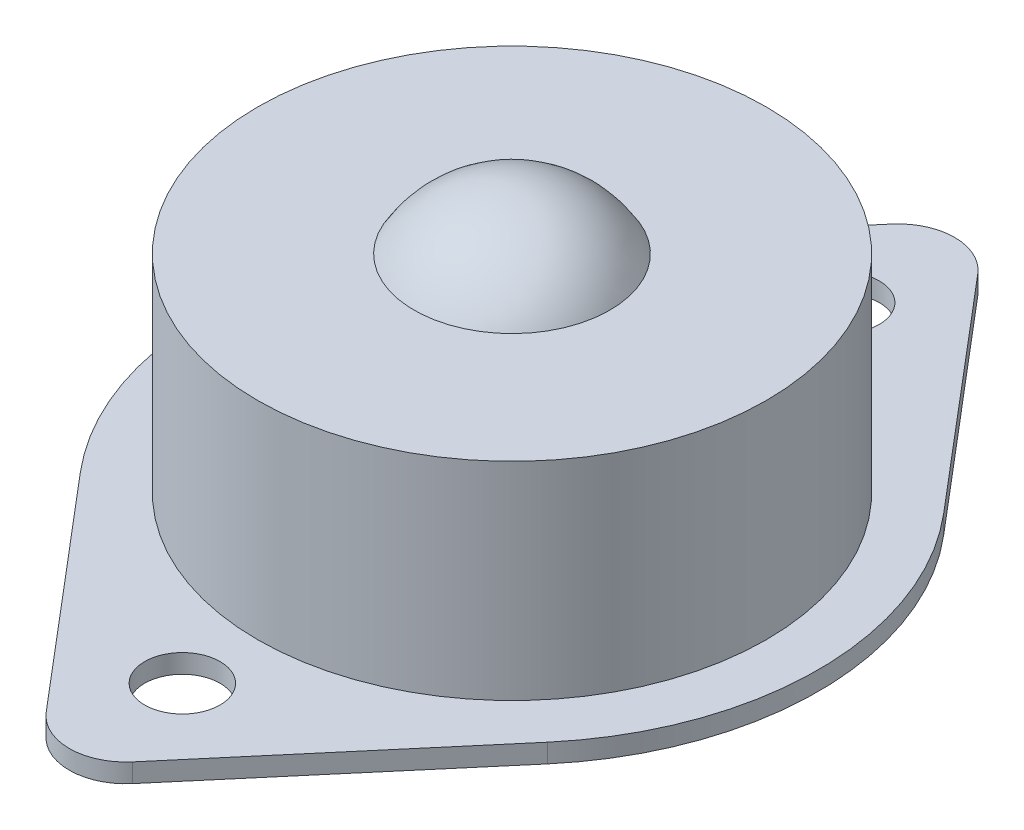
ISO-10303-21;
HEADER;
FILE_DESCRIPTION(('STEP AP214'),'2;1');
FILE_NAME('part.step','',(''),(''),'','','');
FILE_SCHEMA(('AUTOMOTIVE_DESIGN { 1 0 10303 214 1 1 1 1 }'));
ENDSEC;
DATA;
#1=APPLICATION_CONTEXT('core data for automotive mechanical design processes');
#2=APPLICATION_PROTOCOL_DEFINITION('international standard','automotive_design',2000,#1);
#3=PRODUCT_CONTEXT('',#1,'mechanical');
#4=PRODUCT('Part','Part','',(#3));
#5=PRODUCT_RELATED_PRODUCT_CATEGORY('part','',(#4));
#6=PRODUCT_DEFINITION_FORMATION('','',#4);
#7=PRODUCT_DEFINITION_CONTEXT('part definition',#1,'design');
#8=PRODUCT_DEFINITION('design','',#6,#7);
#9=PRODUCT_DEFINITION_SHAPE('','',#8);
#10=(LENGTH_UNIT() NAMED_UNIT(*) SI_UNIT(.MILLI.,.METRE.));
#11=(NAMED_UNIT(*) PLANE_ANGLE_UNIT() SI_UNIT($,.RADIAN.));
#12=(NAMED_UNIT(*) SI_UNIT($,.STERADIAN.) SOLID_ANGLE_UNIT());
#13=UNCERTAINTY_MEASURE_WITH_UNIT(LENGTH_MEASURE(1.E-05),#10,'distance_accuracy_value','');
#14=(GEOMETRIC_REPRESENTATION_CONTEXT(3) GLOBAL_UNCERTAINTY_ASSIGNED_CONTEXT((#13)) GLOBAL_UNIT_ASSIGNED_CONTEXT((#10,
#11,#12)) REPRESENTATION_CONTEXT('',''));
#15=CARTESIAN_POINT('',(0.,0.,0.));
#16=DIRECTION('',(0.,0.,1.));
#17=DIRECTION('',(1.,0.,0.));
#18=AXIS2_PLACEMENT_3D('',#15,#16,#17);
#19=CARTESIAN_POINT('',(0.,0.,0.));
#20=DIRECTION('',(0.,1.,0.));
#21=DIRECTION('',(0.,0.,1.));
#22=AXIS2_PLACEMENT_3D('',#19,#20,#21);
#23=PLANE('',#22);
#24=DIRECTION('',(0.646781165954139,0.,-0.762675634439048));
#25=VECTOR('',#24,1.);
#26=CARTESIAN_POINT('',(2.28802690331715,0.,22.4403434978624));
#27=LINE('',#26,#25);
#28=CARTESIAN_POINT('',(2.28802690331715,0.,22.4403434978624));
#29=VERTEX_POINT('',#28);
#30=CARTESIAN_POINT('',(12.4003537431068,0.,10.5160239688388));
#31=VERTEX_POINT('',#30);
#32=EDGE_CURVE('E121',#29,#31,#27,.T.);
#33=ORIENTED_EDGE('',*,*,#32,.F.);
#34=CARTESIAN_POINT('',(0.,0.,20.5));
#35=DIRECTION('',(0.,1.,0.));
#36=DIRECTION('',(0.,0.,1.));
#37=AXIS2_PLACEMENT_3D('',#34,#35,#36);
#38=CIRCLE('',#37,3.);
#39=CARTESIAN_POINT('',(-2.28802690331714,0.,22.4403434978624));
#40=VERTEX_POINT('',#39);
#41=EDGE_CURVE('E237',#40,#29,#38,.T.);
#42=ORIENTED_EDGE('',*,*,#41,.F.);
#43=DIRECTION('',(0.64678116595414,0.,0.762675634439048));
#44=VECTOR('',#43,1.);
#45=CARTESIAN_POINT('',(-12.4003537431068,0.,10.5160239688388));
#46=LINE('',#45,#44);
#47=CARTESIAN_POINT('',(-12.4003537431068,0.,10.5160239688388));
#48=VERTEX_POINT('',#47);
#49=EDGE_CURVE('E238',#48,#40,#46,.T.);
#50=ORIENTED_EDGE('',*,*,#49,.F.);
#51=CARTESIAN_POINT('',(0.,0.,0.));
#52=DIRECTION('',(0.,1.,0.));
#53=DIRECTION('',(0.,0.,1.));
#54=AXIS2_PLACEMENT_3D('',#51,#52,#53);
#55=CIRCLE('',#54,16.2590139020599);
#56=CARTESIAN_POINT('',(-12.4003537431068,0.,-10.5160239688388));
#57=VERTEX_POINT('',#56);
#58=EDGE_CURVE('E51',#57,#48,#55,.T.);
#59=ORIENTED_EDGE('',*,*,#58,.F.);
#60=DIRECTION('',(-0.646781165954139,0.,0.762675634439048));
#61=VECTOR('',#60,1.);
#62=CARTESIAN_POINT('',(-2.28802690331714,0.,-22.4403434978624));
#63=LINE('',#62,#61);
#64=CARTESIAN_POINT('',(-2.28802690331714,0.,-22.4403434978624));
#65=VERTEX_POINT('',#64);
#66=EDGE_CURVE('E241',#65,#57,#63,.T.);
#67=ORIENTED_EDGE('',*,*,#66,.F.);
#68=CARTESIAN_POINT('',(0.,0.,-20.5));
#69=DIRECTION('',(0.,1.,0.));
#70=DIRECTION('',(0.,0.,1.));
#71=AXIS2_PLACEMENT_3D('',#68,#69,#70);
#72=CIRCLE('',#71,3.);
#73=CARTESIAN_POINT('',(2.28802690331714,0.,-22.4403434978624));
#74=VERTEX_POINT('',#73);
#75=EDGE_CURVE('E231',#74,#65,#72,.T.);
#76=ORIENTED_EDGE('',*,*,#75,.F.);
#77=DIRECTION('',(-0.64678116595414,0.,-0.762675634439048));
#78=VECTOR('',#77,1.);
#79=CARTESIAN_POINT('',(12.4003537431068,0.,-10.5160239688388));
#80=LINE('',#79,#78);
#81=CARTESIAN_POINT('',(12.4003537431068,0.,-10.5160239688388));
#82=VERTEX_POINT('',#81);
#83=EDGE_CURVE('E246',#82,#74,#80,.T.);
#84=ORIENTED_EDGE('',*,*,#83,.F.);
#85=CARTESIAN_POINT('',(0.,0.,0.));
#86=DIRECTION('',(0.,1.,0.));
#87=DIRECTION('',(0.,0.,1.));
#88=AXIS2_PLACEMENT_3D('',#85,#86,#87);
#89=CIRCLE('',#88,16.2590139020599);
#90=EDGE_CURVE('E249',#31,#82,#89,.T.);
#91=ORIENTED_EDGE('',*,*,#90,.F.);
#92=EDGE_LOOP('',(#33,#42,#50,#59,#67,#76,#84,#91));
#93=FACE_BOUND('',#92,.T.);
#94=CARTESIAN_POINT('',(0.,0.,-17.5));
#95=DIRECTION('',(0.,1.,0.));
#96=DIRECTION('',(0.,0.,1.));
#97=AXIS2_PLACEMENT_3D('',#94,#95,#96);
#98=CIRCLE('',#97,2.);
#99=CARTESIAN_POINT('',(0.,0.,-15.5));
#100=VERTEX_POINT('',#99);
#101=EDGE_CURVE('E145',#100,#100,#98,.T.);
#102=ORIENTED_EDGE('',*,*,#101,.T.);
#103=EDGE_LOOP('',(#102));
#104=FACE_BOUND('',#103,.T.);
#105=CARTESIAN_POINT('',(0.,0.,17.5));
#106=DIRECTION('',(0.,1.,0.));
#107=DIRECTION('',(0.,0.,1.));
#108=AXIS2_PLACEMENT_3D('',#105,#106,#107);
#109=CIRCLE('',#108,2.);
#110=CARTESIAN_POINT('',(0.,0.,19.5));
#111=VERTEX_POINT('',#110);
#112=EDGE_CURVE('E128',#111,#111,#109,.T.);
#113=ORIENTED_EDGE('',*,*,#112,.T.);
#114=EDGE_LOOP('',(#113));
#115=FACE_BOUND('',#114,.T.);
#116=ADVANCED_FACE('F37',(#93,#104,#115),#23,.F.);
#117=CARTESIAN_POINT('',(0.,9.,0.));
#118=DIRECTION('',(0.,-1.,0.));
#119=DIRECTION('',(0.,0.,-1.));
#120=AXIS2_PLACEMENT_3D('',#117,#118,#119);
#121=SPHERICAL_SURFACE('',#120,6.);
#122=CARTESIAN_POINT('',(0.,12.,0.));
#123=DIRECTION('',(0.,-1.,0.));
#124=DIRECTION('',(0.,0.,-1.));
#125=AXIS2_PLACEMENT_3D('',#122,#123,#124);
#126=CIRCLE('',#125,5.19615242270663);
#127=CARTESIAN_POINT('',(0.,12.,-5.19615242270663));
#128=VERTEX_POINT('',#127);
#129=EDGE_CURVE('E11',#128,#128,#126,.T.);
#130=ORIENTED_EDGE('',*,*,#129,.F.);
#131=EDGE_LOOP('',(#130));
#132=FACE_BOUND('',#131,.T.);
#133=ADVANCED_FACE('F163',(#132),#121,.T.);
#134=CARTESIAN_POINT('',(0.,12.,13.5));
#135=DIRECTION('',(0.,-1.,0.));
#136=DIRECTION('',(0.,0.,-1.));
#137=AXIS2_PLACEMENT_3D('',#134,#135,#136);
#138=PLANE('',#137);
#139=CARTESIAN_POINT('',(0.,12.,0.));
#140=DIRECTION('',(0.,-1.,0.));
#141=DIRECTION('',(0.,0.,-1.));
#142=AXIS2_PLACEMENT_3D('',#139,#140,#141);
#143=CIRCLE('',#142,13.5);
#144=CARTESIAN_POINT('',(0.,12.,-13.5));
#145=VERTEX_POINT('',#144);
#146=EDGE_CURVE('E44',#145,#145,#143,.T.);
#147=ORIENTED_EDGE('',*,*,#146,.F.);
#148=EDGE_LOOP('',(#147));
#149=FACE_BOUND('',#148,.T.);
#150=ORIENTED_EDGE('',*,*,#129,.T.);
#151=EDGE_LOOP('',(#150));
#152=FACE_BOUND('',#151,.T.);
#153=ADVANCED_FACE('F160',(#149,#152),#138,.F.);
#154=CARTESIAN_POINT('',(0.,0.,0.));
#155=DIRECTION('',(0.,-1.,0.));
#156=DIRECTION('',(0.,0.,-1.));
#157=AXIS2_PLACEMENT_3D('',#154,#155,#156);
#158=CYLINDRICAL_SURFACE('',#157,13.5);
#159=CARTESIAN_POINT('',(0.,0.999999999999997,0.));
#160=DIRECTION('',(0.,-1.,0.));
#161=DIRECTION('',(0.,0.,-1.));
#162=AXIS2_PLACEMENT_3D('',#159,#160,#161);
#163=CIRCLE('',#162,13.5);
#164=CARTESIAN_POINT('',(0.,0.999999999999997,-13.5));
#165=VERTEX_POINT('',#164);
#166=EDGE_CURVE('E150',#165,#165,#163,.T.);
#167=ORIENTED_EDGE('',*,*,#166,.F.);
#168=EDGE_LOOP('',(#167));
#169=FACE_BOUND('',#168,.T.);
#170=ORIENTED_EDGE('',*,*,#146,.T.);
#171=EDGE_LOOP('',(#170));
#172=FACE_BOUND('',#171,.T.);
#173=ADVANCED_FACE('F158',(#169,#172),#158,.T.);
#174=CARTESIAN_POINT('',(0.,0.999999999999997,23.5));
#175=DIRECTION('',(0.,-1.,0.));
#176=DIRECTION('',(0.,0.,-1.));
#177=AXIS2_PLACEMENT_3D('',#174,#175,#176);
#178=PLANE('',#177);
#179=CARTESIAN_POINT('',(0.,0.999999999999997,-17.5));
#180=DIRECTION('',(0.,-1.,0.));
#181=DIRECTION('',(0.,0.,-1.));
#182=AXIS2_PLACEMENT_3D('',#179,#180,#181);
#183=CIRCLE('',#182,2.);
#184=CARTESIAN_POINT('',(0.,0.999999999999997,-19.5));
#185=VERTEX_POINT('',#184);
#186=EDGE_CURVE('E148',#185,#185,#183,.T.);
#187=ORIENTED_EDGE('',*,*,#186,.T.);
#188=EDGE_LOOP('',(#187));
#189=FACE_BOUND('',#188,.T.);
#190=CARTESIAN_POINT('',(0.,0.999999999999997,17.5));
#191=DIRECTION('',(0.,-1.,0.));
#192=DIRECTION('',(0.,0.,-1.));
#193=AXIS2_PLACEMENT_3D('',#190,#191,#192);
#194=CIRCLE('',#193,2.);
#195=CARTESIAN_POINT('',(0.,0.999999999999997,15.5));
#196=VERTEX_POINT('',#195);
#197=EDGE_CURVE('E131',#196,#196,#194,.T.);
#198=ORIENTED_EDGE('',*,*,#197,.T.);
#199=EDGE_LOOP('',(#198));
#200=FACE_BOUND('',#199,.T.);
#201=DIRECTION('',(-0.64678116595414,0.,-0.762675634439048));
#202=VECTOR('',#201,1.);
#203=CARTESIAN_POINT('',(-12.4003537431068,1.,10.5160239688388));
#204=LINE('',#203,#202);
#205=CARTESIAN_POINT('',(-2.28802690331714,0.999999999999997,22.4403434978624));
#206=VERTEX_POINT('',#205);
#207=CARTESIAN_POINT('',(-12.4003537431068,1.,10.5160239688388));
#208=VERTEX_POINT('',#207);
#209=EDGE_CURVE('E144',#206,#208,#204,.T.);
#210=ORIENTED_EDGE('',*,*,#209,.F.);
#211=CARTESIAN_POINT('',(0.,1.,20.5));
#212=DIRECTION('',(0.,-1.,0.));
#213=DIRECTION('',(0.,0.,-1.));
#214=AXIS2_PLACEMENT_3D('',#211,#212,#213);
#215=CIRCLE('',#214,3.);
#216=CARTESIAN_POINT('',(2.28802690331715,1.,22.4403434978624));
#217=VERTEX_POINT('',#216);
#218=EDGE_CURVE('E59',#217,#206,#215,.T.);
#219=ORIENTED_EDGE('',*,*,#218,.F.);
#220=DIRECTION('',(-0.646781165954139,0.,0.762675634439048));
#221=VECTOR('',#220,1.);
#222=CARTESIAN_POINT('',(2.28802690331715,1.,22.4403434978624));
#223=LINE('',#222,#221);
#224=CARTESIAN_POINT('',(12.4003537431068,1.,10.5160239688388));
#225=VERTEX_POINT('',#224);
#226=EDGE_CURVE('E114',#225,#217,#223,.T.);
#227=ORIENTED_EDGE('',*,*,#226,.F.);
#228=CARTESIAN_POINT('',(0.,1.,0.));
#229=DIRECTION('',(0.,-1.,0.));
#230=DIRECTION('',(0.,0.,-1.));
#231=AXIS2_PLACEMENT_3D('',#228,#229,#230);
#232=CIRCLE('',#231,16.2590139020599);
#233=CARTESIAN_POINT('',(12.4003537431068,1.,-10.5160239688388));
#234=VERTEX_POINT('',#233);
#235=EDGE_CURVE('E104',#234,#225,#232,.T.);
#236=ORIENTED_EDGE('',*,*,#235,.F.);
#237=DIRECTION('',(0.64678116595414,0.,0.762675634439048));
#238=VECTOR('',#237,1.);
#239=CARTESIAN_POINT('',(12.4003537431068,1.,-10.5160239688388));
#240=LINE('',#239,#238);
#241=CARTESIAN_POINT('',(2.28802690331714,1.,-22.4403434978624));
#242=VERTEX_POINT('',#241);
#243=EDGE_CURVE('E115',#242,#234,#240,.T.);
#244=ORIENTED_EDGE('',*,*,#243,.F.);
#245=CARTESIAN_POINT('',(0.,1.,-20.5));
#246=DIRECTION('',(0.,-1.,0.));
#247=DIRECTION('',(0.,0.,-1.));
#248=AXIS2_PLACEMENT_3D('',#245,#246,#247);
#249=CIRCLE('',#248,3.);
#250=CARTESIAN_POINT('',(-2.28802690331714,1.,-22.4403434978624));
#251=VERTEX_POINT('',#250);
#252=EDGE_CURVE('E137',#251,#242,#249,.T.);
#253=ORIENTED_EDGE('',*,*,#252,.F.);
#254=DIRECTION('',(0.64678116595414,0.,-0.762675634439048));
#255=VECTOR('',#254,1.);
#256=CARTESIAN_POINT('',(-2.28802690331714,1.,-22.4403434978624));
#257=LINE('',#256,#255);
#258=CARTESIAN_POINT('',(-12.4003537431068,1.,-10.5160239688388));
#259=VERTEX_POINT('',#258);
#260=EDGE_CURVE('E139',#259,#251,#257,.T.);
#261=ORIENTED_EDGE('',*,*,#260,.F.);
#262=CARTESIAN_POINT('',(0.,1.,0.));
#263=DIRECTION('',(0.,-1.,0.));
#264=DIRECTION('',(0.,0.,-1.));
#265=AXIS2_PLACEMENT_3D('',#262,#263,#264);
#266=CIRCLE('',#265,16.2590139020599);
#267=EDGE_CURVE('E142',#208,#259,#266,.T.);
#268=ORIENTED_EDGE('',*,*,#267,.F.);
#269=EDGE_LOOP('',(#210,#219,#227,#236,#244,#253,#261,#268));
#270=FACE_BOUND('',#269,.T.);
#271=ORIENTED_EDGE('',*,*,#166,.T.);
#272=EDGE_LOOP('',(#271));
#273=FACE_BOUND('',#272,.T.);
#274=ADVANCED_FACE('F126',(#189,#200,#270,#273),#178,.F.);
#275=CARTESIAN_POINT('',(0.,6.65685424949238,17.5));
#276=DIRECTION('',(0.,-1.,0.));
#277=DIRECTION('',(0.,0.,-1.));
#278=AXIS2_PLACEMENT_3D('',#275,#276,#277);
#279=CYLINDRICAL_SURFACE('',#278,2.);
#280=ORIENTED_EDGE('',*,*,#197,.F.);
#281=EDGE_LOOP('',(#280));
#282=FACE_BOUND('',#281,.T.);
#283=ORIENTED_EDGE('',*,*,#112,.F.);
#284=EDGE_LOOP('',(#283));
#285=FACE_BOUND('',#284,.T.);
#286=ADVANCED_FACE('F178',(#282,#285),#279,.F.);
#287=CARTESIAN_POINT('',(0.,6.65685424949238,-17.5));
#288=DIRECTION('',(0.,-1.,0.));
#289=DIRECTION('',(0.,0.,-1.));
#290=AXIS2_PLACEMENT_3D('',#287,#288,#289);
#291=CYLINDRICAL_SURFACE('',#290,2.);
#292=ORIENTED_EDGE('',*,*,#186,.F.);
#293=EDGE_LOOP('',(#292));
#294=FACE_BOUND('',#293,.T.);
#295=ORIENTED_EDGE('',*,*,#101,.F.);
#296=EDGE_LOOP('',(#295));
#297=FACE_BOUND('',#296,.T.);
#298=ADVANCED_FACE('F182',(#294,#297),#291,.F.);
#299=CARTESIAN_POINT('',(0.,95.2040286981198,20.5));
#300=DIRECTION('',(0.,-1.,0.));
#301=DIRECTION('',(0.,0.,-1.));
#302=AXIS2_PLACEMENT_3D('',#299,#300,#301);
#303=CYLINDRICAL_SURFACE('',#302,3.);
#304=ORIENTED_EDGE('',*,*,#218,.T.);
#305=DIRECTION('',(0.,-1.,0.));
#306=VECTOR('',#305,1.);
#307=CARTESIAN_POINT('',(-2.28802690331714,95.2040286981198,22.4403434978624));
#308=LINE('',#307,#306);
#309=EDGE_CURVE('E217',#206,#40,#308,.T.);
#310=ORIENTED_EDGE('',*,*,#309,.T.);
#311=ORIENTED_EDGE('',*,*,#41,.T.);
#312=DIRECTION('',(0.,-1.,0.));
#313=VECTOR('',#312,1.);
#314=CARTESIAN_POINT('',(2.28802690331715,95.2040286981198,22.4403434978624));
#315=LINE('',#314,#313);
#316=EDGE_CURVE('E123',#217,#29,#315,.T.);
#317=ORIENTED_EDGE('',*,*,#316,.F.);
#318=EDGE_LOOP('',(#304,#310,#311,#317));
#319=FACE_BOUND('',#318,.T.);
#320=ADVANCED_FACE('F186',(#319),#303,.T.);
#321=CARTESIAN_POINT('',(0.,95.2040286981198,-20.5));
#322=DIRECTION('',(0.,-1.,0.));
#323=DIRECTION('',(0.,0.,-1.));
#324=AXIS2_PLACEMENT_3D('',#321,#322,#323);
#325=CYLINDRICAL_SURFACE('',#324,3.);
#326=ORIENTED_EDGE('',*,*,#252,.T.);
#327=DIRECTION('',(0.,-1.,0.));
#328=VECTOR('',#327,1.);
#329=CARTESIAN_POINT('',(2.28802690331714,95.2040286981198,-22.4403434978624));
#330=LINE('',#329,#328);
#331=EDGE_CURVE('E232',#242,#74,#330,.T.);
#332=ORIENTED_EDGE('',*,*,#331,.T.);
#333=ORIENTED_EDGE('',*,*,#75,.T.);
#334=DIRECTION('',(0.,-1.,0.));
#335=VECTOR('',#334,1.);
#336=CARTESIAN_POINT('',(-2.28802690331714,95.2040286981198,-22.4403434978624));
#337=LINE('',#336,#335);
#338=EDGE_CURVE('E227',#251,#65,#337,.T.);
#339=ORIENTED_EDGE('',*,*,#338,.F.);
#340=EDGE_LOOP('',(#326,#332,#333,#339));
#341=FACE_BOUND('',#340,.T.);
#342=ADVANCED_FACE('F190',(#341),#325,.T.);
#343=CARTESIAN_POINT('',(2.28802690331715,95.2040286981198,22.4403434978624));
#344=DIRECTION('',(-0.762675634439048,0.,-0.646781165954139));
#345=DIRECTION('',(-0.646781165954139,0.,0.762675634439048));
#346=AXIS2_PLACEMENT_3D('',#343,#344,#345);
#347=PLANE('',#346);
#348=ORIENTED_EDGE('',*,*,#226,.T.);
#349=ORIENTED_EDGE('',*,*,#316,.T.);
#350=ORIENTED_EDGE('',*,*,#32,.T.);
#351=DIRECTION('',(0.,-1.,0.));
#352=VECTOR('',#351,1.);
#353=CARTESIAN_POINT('',(12.4003537431068,95.2040286981198,10.5160239688388));
#354=LINE('',#353,#352);
#355=EDGE_CURVE('E108',#225,#31,#354,.T.);
#356=ORIENTED_EDGE('',*,*,#355,.F.);
#357=EDGE_LOOP('',(#348,#349,#350,#356));
#358=FACE_BOUND('',#357,.T.);
#359=ADVANCED_FACE('F118',(#358),#347,.F.);
#360=CARTESIAN_POINT('',(0.,95.2040286981198,0.));
#361=DIRECTION('',(0.,-1.,0.));
#362=DIRECTION('',(0.,0.,-1.));
#363=AXIS2_PLACEMENT_3D('',#360,#361,#362);
#364=CYLINDRICAL_SURFACE('',#363,16.2590139020599);
#365=ORIENTED_EDGE('',*,*,#235,.T.);
#366=ORIENTED_EDGE('',*,*,#355,.T.);
#367=ORIENTED_EDGE('',*,*,#90,.T.);
#368=DIRECTION('',(0.,-1.,0.));
#369=VECTOR('',#368,1.);
#370=CARTESIAN_POINT('',(12.4003537431068,95.2040286981198,-10.5160239688388));
#371=LINE('',#370,#369);
#372=EDGE_CURVE('E110',#234,#82,#371,.T.);
#373=ORIENTED_EDGE('',*,*,#372,.F.);
#374=EDGE_LOOP('',(#365,#366,#367,#373));
#375=FACE_BOUND('',#374,.T.);
#376=ADVANCED_FACE('F106',(#375),#364,.T.);
#377=CARTESIAN_POINT('',(12.4003537431068,95.2040286981198,-10.5160239688388));
#378=DIRECTION('',(-0.762675634439048,0.,0.64678116595414));
#379=DIRECTION('',(0.64678116595414,0.,0.762675634439048));
#380=AXIS2_PLACEMENT_3D('',#377,#378,#379);
#381=PLANE('',#380);
#382=ORIENTED_EDGE('',*,*,#243,.T.);
#383=ORIENTED_EDGE('',*,*,#372,.T.);
#384=ORIENTED_EDGE('',*,*,#83,.T.);
#385=ORIENTED_EDGE('',*,*,#331,.F.);
#386=EDGE_LOOP('',(#382,#383,#384,#385));
#387=FACE_BOUND('',#386,.T.);
#388=ADVANCED_FACE('F195',(#387),#381,.F.);
#389=CARTESIAN_POINT('',(-2.28802690331714,95.2040286981198,-22.4403434978624));
#390=DIRECTION('',(0.762675634439048,0.,0.64678116595414));
#391=DIRECTION('',(0.64678116595414,0.,-0.762675634439048));
#392=AXIS2_PLACEMENT_3D('',#389,#390,#391);
#393=PLANE('',#392);
#394=ORIENTED_EDGE('',*,*,#260,.T.);
#395=ORIENTED_EDGE('',*,*,#338,.T.);
#396=ORIENTED_EDGE('',*,*,#66,.T.);
#397=DIRECTION('',(0.,-1.,0.));
#398=VECTOR('',#397,1.);
#399=CARTESIAN_POINT('',(-12.4003537431068,95.2040286981198,-10.5160239688388));
#400=LINE('',#399,#398);
#401=EDGE_CURVE('E221',#259,#57,#400,.T.);
#402=ORIENTED_EDGE('',*,*,#401,.F.);
#403=EDGE_LOOP('',(#394,#395,#396,#402));
#404=FACE_BOUND('',#403,.T.);
#405=ADVANCED_FACE('F198',(#404),#393,.F.);
#406=CARTESIAN_POINT('',(0.,95.2040286981198,0.));
#407=DIRECTION('',(0.,-1.,0.));
#408=DIRECTION('',(0.,0.,-1.));
#409=AXIS2_PLACEMENT_3D('',#406,#407,#408);
#410=CYLINDRICAL_SURFACE('',#409,16.2590139020599);
#411=ORIENTED_EDGE('',*,*,#267,.T.);
#412=ORIENTED_EDGE('',*,*,#401,.T.);
#413=ORIENTED_EDGE('',*,*,#58,.T.);
#414=DIRECTION('',(0.,-1.,0.));
#415=VECTOR('',#414,1.);
#416=CARTESIAN_POINT('',(-12.4003537431068,95.2040286981198,10.5160239688388));
#417=LINE('',#416,#415);
#418=EDGE_CURVE('E215',#208,#48,#417,.T.);
#419=ORIENTED_EDGE('',*,*,#418,.F.);
#420=EDGE_LOOP('',(#411,#412,#413,#419));
#421=FACE_BOUND('',#420,.T.);
#422=ADVANCED_FACE('F205',(#421),#410,.T.);
#423=CARTESIAN_POINT('',(-12.4003537431068,95.2040286981198,10.5160239688388));
#424=DIRECTION('',(0.762675634439048,0.,-0.64678116595414));
#425=DIRECTION('',(-0.64678116595414,0.,-0.762675634439048));
#426=AXIS2_PLACEMENT_3D('',#423,#424,#425);
#427=PLANE('',#426);
#428=ORIENTED_EDGE('',*,*,#209,.T.);
#429=ORIENTED_EDGE('',*,*,#418,.T.);
#430=ORIENTED_EDGE('',*,*,#49,.T.);
#431=ORIENTED_EDGE('',*,*,#309,.F.);
#432=EDGE_LOOP('',(#428,#429,#430,#431));
#433=FACE_BOUND('',#432,.T.);
#434=ADVANCED_FACE('F209',(#433),#427,.F.);
#435=CLOSED_SHELL('',(#116,#133,#153,#173,#274,#286,#298,#320,#342,#359,#376,#388,#405,#422,#434));
#436=MANIFOLD_SOLID_BREP('B2',#435);
#437=ADVANCED_BREP_SHAPE_REPRESENTATION('',(#18,#436),#14);
#438=SHAPE_DEFINITION_REPRESENTATION(#9,#437);
ENDSEC;
END-ISO-10303-21;
